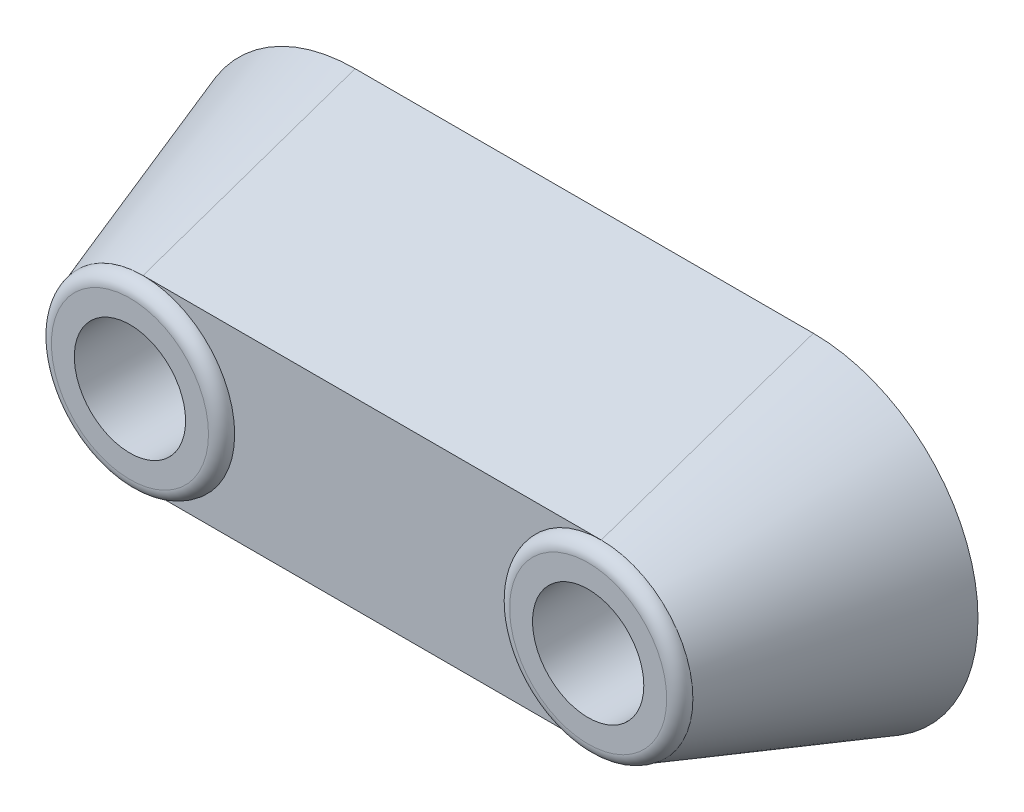
ISO-10303-21;
HEADER;
FILE_DESCRIPTION(('STEP AP214'),'2;1');
FILE_NAME('part.step','',(''),(''),'','','');
FILE_SCHEMA(('AUTOMOTIVE_DESIGN { 1 0 10303 214 1 1 1 1 }'));
ENDSEC;
DATA;
#1=APPLICATION_CONTEXT('core data for automotive mechanical design processes');
#2=APPLICATION_PROTOCOL_DEFINITION('international standard','automotive_design',2000,#1);
#3=PRODUCT_CONTEXT('',#1,'mechanical');
#4=PRODUCT('Part','Part','',(#3));
#5=PRODUCT_RELATED_PRODUCT_CATEGORY('part','',(#4));
#6=PRODUCT_DEFINITION_FORMATION('','',#4);
#7=PRODUCT_DEFINITION_CONTEXT('part definition',#1,'design');
#8=PRODUCT_DEFINITION('design','',#6,#7);
#9=PRODUCT_DEFINITION_SHAPE('','',#8);
#10=(LENGTH_UNIT() NAMED_UNIT(*) SI_UNIT(.MILLI.,.METRE.));
#11=(NAMED_UNIT(*) PLANE_ANGLE_UNIT() SI_UNIT($,.RADIAN.));
#12=(NAMED_UNIT(*) SI_UNIT($,.STERADIAN.) SOLID_ANGLE_UNIT());
#13=UNCERTAINTY_MEASURE_WITH_UNIT(LENGTH_MEASURE(1.E-05),#10,'distance_accuracy_value','');
#14=(GEOMETRIC_REPRESENTATION_CONTEXT(3) GLOBAL_UNCERTAINTY_ASSIGNED_CONTEXT((#13)) GLOBAL_UNIT_ASSIGNED_CONTEXT((#10,
#11,#12)) REPRESENTATION_CONTEXT('',''));
#15=CARTESIAN_POINT('',(0.,0.,0.));
#16=DIRECTION('',(0.,0.,1.));
#17=DIRECTION('',(1.,0.,0.));
#18=AXIS2_PLACEMENT_3D('',#15,#16,#17);
#19=CARTESIAN_POINT('',(-20.,-14.5,3.));
#20=DIRECTION('',(0.,0.,1.));
#21=DIRECTION('',(1.,0.,0.));
#22=AXIS2_PLACEMENT_3D('',#19,#20,#21);
#23=PLANE('',#22);
#24=CARTESIAN_POINT('',(9.,-26.5,3.));
#25=DIRECTION('',(0.,0.,1.));
#26=DIRECTION('',(1.,0.,0.));
#27=AXIS2_PLACEMENT_3D('',#24,#25,#26);
#28=CIRCLE('',#27,7.);
#29=CARTESIAN_POINT('',(9.,-19.5,3.));
#30=VERTEX_POINT('',#29);
#31=CARTESIAN_POINT('',(9.,-33.5,3.));
#32=VERTEX_POINT('',#31);
#33=EDGE_CURVE('E48',#30,#32,#28,.T.);
#34=ORIENTED_EDGE('',*,*,#33,.F.);
#35=DIRECTION('',(-1.,0.,0.));
#36=VECTOR('',#35,1.);
#37=CARTESIAN_POINT('',(-26.,-19.5,3.));
#38=LINE('',#37,#36);
#39=CARTESIAN_POINT('',(-26.,-19.5,3.));
#40=VERTEX_POINT('',#39);
#41=EDGE_CURVE('E69',#30,#40,#38,.T.);
#42=ORIENTED_EDGE('',*,*,#41,.T.);
#43=CARTESIAN_POINT('',(-26.,-26.5,3.));
#44=DIRECTION('',(0.,0.,1.));
#45=DIRECTION('',(1.,0.,0.));
#46=AXIS2_PLACEMENT_3D('',#43,#44,#45);
#47=CIRCLE('',#46,7.);
#48=CARTESIAN_POINT('',(-26.,-33.5,3.));
#49=VERTEX_POINT('',#48);
#50=EDGE_CURVE('E71',#49,#40,#47,.T.);
#51=ORIENTED_EDGE('',*,*,#50,.F.);
#52=DIRECTION('',(1.,0.,0.));
#53=VECTOR('',#52,1.);
#54=CARTESIAN_POINT('',(9.,-33.5,3.));
#55=LINE('',#54,#53);
#56=EDGE_CURVE('E75',#49,#32,#55,.T.);
#57=ORIENTED_EDGE('',*,*,#56,.T.);
#58=EDGE_LOOP('',(#34,#42,#51,#57));
#59=FACE_BOUND('',#58,.T.);
#60=ADVANCED_FACE('F33',(#59),#23,.T.);
#61=CARTESIAN_POINT('',(9.,-26.5,3.));
#62=DIRECTION('',(0.,0.,-1.));
#63=DIRECTION('',(-1.,0.,0.));
#64=AXIS2_PLACEMENT_3D('',#61,#62,#63);
#65=CYLINDRICAL_SURFACE('',#64,4.25);
#66=CARTESIAN_POINT('',(9.,-26.5,4.));
#67=DIRECTION('',(0.,0.,1.));
#68=DIRECTION('',(1.,0.,0.));
#69=AXIS2_PLACEMENT_3D('',#66,#67,#68);
#70=CIRCLE('',#69,4.25);
#71=CARTESIAN_POINT('',(13.25,-26.5,4.));
#72=VERTEX_POINT('',#71);
#73=EDGE_CURVE('E91',#72,#72,#70,.T.);
#74=ORIENTED_EDGE('',*,*,#73,.T.);
#75=EDGE_LOOP('',(#74));
#76=FACE_BOUND('',#75,.T.);
#77=CARTESIAN_POINT('',(9.,-26.5,-13.2));
#78=DIRECTION('',(0.,0.,1.));
#79=DIRECTION('',(1.,0.,0.));
#80=AXIS2_PLACEMENT_3D('',#77,#78,#79);
#81=CIRCLE('',#80,4.25);
#82=CARTESIAN_POINT('',(13.25,-26.5,-13.2));
#83=VERTEX_POINT('',#82);
#84=EDGE_CURVE('E250',#83,#83,#81,.T.);
#85=ORIENTED_EDGE('',*,*,#84,.F.);
#86=EDGE_LOOP('',(#85));
#87=FACE_BOUND('',#86,.T.);
#88=ADVANCED_FACE('F125',(#76,#87),#65,.F.);
#89=CARTESIAN_POINT('',(-26.,-26.5,3.));
#90=DIRECTION('',(0.,0.,-1.));
#91=DIRECTION('',(-1.,0.,0.));
#92=AXIS2_PLACEMENT_3D('',#89,#90,#91);
#93=CYLINDRICAL_SURFACE('',#92,4.25);
#94=CARTESIAN_POINT('',(-26.,-26.5,4.));
#95=DIRECTION('',(0.,0.,1.));
#96=DIRECTION('',(1.,0.,0.));
#97=AXIS2_PLACEMENT_3D('',#94,#95,#96);
#98=CIRCLE('',#97,4.25);
#99=CARTESIAN_POINT('',(-21.75,-26.5,4.));
#100=VERTEX_POINT('',#99);
#101=EDGE_CURVE('E76',#100,#100,#98,.T.);
#102=ORIENTED_EDGE('',*,*,#101,.T.);
#103=EDGE_LOOP('',(#102));
#104=FACE_BOUND('',#103,.T.);
#105=CARTESIAN_POINT('',(-26.,-26.5,-13.2));
#106=DIRECTION('',(0.,0.,1.));
#107=DIRECTION('',(1.,0.,0.));
#108=AXIS2_PLACEMENT_3D('',#105,#106,#107);
#109=CIRCLE('',#108,4.25);
#110=CARTESIAN_POINT('',(-21.75,-26.5,-13.2));
#111=VERTEX_POINT('',#110);
#112=EDGE_CURVE('E249',#111,#111,#109,.T.);
#113=ORIENTED_EDGE('',*,*,#112,.F.);
#114=EDGE_LOOP('',(#113));
#115=FACE_BOUND('',#114,.T.);
#116=ADVANCED_FACE('F130',(#104,#115),#93,.F.);
#117=CARTESIAN_POINT('',(-26.,-26.5,4.));
#118=DIRECTION('',(0.,0.,1.));
#119=DIRECTION('',(1.,0.,0.));
#120=AXIS2_PLACEMENT_3D('',#117,#118,#119);
#121=PLANE('',#120);
#122=CARTESIAN_POINT('',(-26.,-26.5,4.));
#123=DIRECTION('',(0.,0.,1.));
#124=DIRECTION('',(1.,0.,0.));
#125=AXIS2_PLACEMENT_3D('',#122,#123,#124);
#126=CIRCLE('',#125,6.);
#127=CARTESIAN_POINT('',(-20.,-26.5,4.));
#128=VERTEX_POINT('',#127);
#129=EDGE_CURVE('E41',#128,#128,#126,.T.);
#130=ORIENTED_EDGE('',*,*,#129,.T.);
#131=EDGE_LOOP('',(#130));
#132=FACE_BOUND('',#131,.T.);
#133=ORIENTED_EDGE('',*,*,#101,.F.);
#134=EDGE_LOOP('',(#133));
#135=FACE_BOUND('',#134,.T.);
#136=ADVANCED_FACE('F112',(#132,#135),#121,.T.);
#137=CARTESIAN_POINT('',(9.,-26.5,4.));
#138=DIRECTION('',(0.,0.,1.));
#139=DIRECTION('',(1.,0.,0.));
#140=AXIS2_PLACEMENT_3D('',#137,#138,#139);
#141=PLANE('',#140);
#142=CARTESIAN_POINT('',(9.,-26.5,4.));
#143=DIRECTION('',(0.,0.,1.));
#144=DIRECTION('',(1.,0.,0.));
#145=AXIS2_PLACEMENT_3D('',#142,#143,#144);
#146=CIRCLE('',#145,6.);
#147=CARTESIAN_POINT('',(15.,-26.5,4.));
#148=VERTEX_POINT('',#147);
#149=EDGE_CURVE('E81',#148,#148,#146,.T.);
#150=ORIENTED_EDGE('',*,*,#149,.T.);
#151=EDGE_LOOP('',(#150));
#152=FACE_BOUND('',#151,.T.);
#153=ORIENTED_EDGE('',*,*,#73,.F.);
#154=EDGE_LOOP('',(#153));
#155=FACE_BOUND('',#154,.T.);
#156=ADVANCED_FACE('F123',(#152,#155),#141,.T.);
#157=CARTESIAN_POINT('',(9.,-26.5,3.));
#158=DIRECTION('',(0.,0.,1.));
#159=DIRECTION('',(1.,0.,0.));
#160=AXIS2_PLACEMENT_3D('',#157,#158,#159);
#161=TOROIDAL_SURFACE('',#160,6.,1.);
#162=ORIENTED_EDGE('',*,*,#33,.T.);
#163=EDGE_CURVE('E232',#32,#30,#28,.T.);
#164=ORIENTED_EDGE('',*,*,#163,.T.);
#165=EDGE_LOOP('',(#162,#164));
#166=FACE_BOUND('',#165,.T.);
#167=ORIENTED_EDGE('',*,*,#149,.F.);
#168=EDGE_LOOP('',(#167));
#169=FACE_BOUND('',#168,.T.);
#170=ADVANCED_FACE('F116',(#166,#169),#161,.T.);
#171=CARTESIAN_POINT('',(-26.,-26.5,3.));
#172=DIRECTION('',(0.,0.,1.));
#173=DIRECTION('',(1.,0.,0.));
#174=AXIS2_PLACEMENT_3D('',#171,#172,#173);
#175=TOROIDAL_SURFACE('',#174,6.,1.);
#176=ORIENTED_EDGE('',*,*,#50,.T.);
#177=CARTESIAN_POINT('',(-26.,-26.5,3.));
#178=DIRECTION('',(0.,0.,1.));
#179=DIRECTION('',(1.,0.,0.));
#180=AXIS2_PLACEMENT_3D('',#177,#178,#179);
#181=CIRCLE('',#180,7.);
#182=EDGE_CURVE('E11',#49,#40,#181,.F.);
#183=ORIENTED_EDGE('',*,*,#182,.F.);
#184=EDGE_LOOP('',(#176,#183));
#185=FACE_BOUND('',#184,.T.);
#186=ORIENTED_EDGE('',*,*,#129,.F.);
#187=EDGE_LOOP('',(#186));
#188=FACE_BOUND('',#187,.T.);
#189=ADVANCED_FACE('F35',(#185,#188),#175,.T.);
#190=CARTESIAN_POINT('',(-26.,-26.5,-13.2));
#191=DIRECTION('',(0.,0.,1.));
#192=DIRECTION('',(1.,0.,0.));
#193=AXIS2_PLACEMENT_3D('',#190,#191,#192);
#194=PLANE('',#193);
#195=ORIENTED_EDGE('',*,*,#112,.T.);
#196=EDGE_LOOP('',(#195));
#197=FACE_BOUND('',#196,.T.);
#198=ORIENTED_EDGE('',*,*,#84,.T.);
#199=EDGE_LOOP('',(#198));
#200=FACE_BOUND('',#199,.T.);
#201=CARTESIAN_POINT('',(-26.,-26.5,-13.2));
#202=DIRECTION('',(0.,0.,1.));
#203=DIRECTION('',(1.,0.,0.));
#204=AXIS2_PLACEMENT_3D('',#201,#202,#203);
#205=CIRCLE('',#204,12.5781073352926);
#206=CARTESIAN_POINT('',(-26.,-13.9218926647074,-13.2));
#207=VERTEX_POINT('',#206);
#208=CARTESIAN_POINT('',(-26.,-39.0781073352926,-13.2));
#209=VERTEX_POINT('',#208);
#210=EDGE_CURVE('E97',#207,#209,#205,.T.);
#211=ORIENTED_EDGE('',*,*,#210,.F.);
#212=DIRECTION('',(-1.,0.,0.));
#213=VECTOR('',#212,1.);
#214=CARTESIAN_POINT('',(-26.,-13.9218926647074,-13.2));
#215=LINE('',#214,#213);
#216=CARTESIAN_POINT('',(9.,-13.9218926647074,-13.2));
#217=VERTEX_POINT('',#216);
#218=EDGE_CURVE('E87',#217,#207,#215,.T.);
#219=ORIENTED_EDGE('',*,*,#218,.F.);
#220=CARTESIAN_POINT('',(9.,-26.5,-13.2));
#221=DIRECTION('',(0.,0.,1.));
#222=DIRECTION('',(1.,0.,0.));
#223=AXIS2_PLACEMENT_3D('',#220,#221,#222);
#224=CIRCLE('',#223,12.5781073352926);
#225=CARTESIAN_POINT('',(9.00000000000001,-39.0781073352926,-13.2));
#226=VERTEX_POINT('',#225);
#227=EDGE_CURVE('E245',#226,#217,#224,.T.);
#228=ORIENTED_EDGE('',*,*,#227,.F.);
#229=DIRECTION('',(1.,0.,0.));
#230=VECTOR('',#229,1.);
#231=CARTESIAN_POINT('',(-26.,-39.0781073352926,-13.2));
#232=LINE('',#231,#230);
#233=EDGE_CURVE('E243',#209,#226,#232,.T.);
#234=ORIENTED_EDGE('',*,*,#233,.F.);
#235=EDGE_LOOP('',(#211,#219,#228,#234));
#236=FACE_BOUND('',#235,.T.);
#237=ADVANCED_FACE('F115',(#197,#200,#236),#194,.F.);
#238=CARTESIAN_POINT('',(-26.,-33.5,3.));
#239=DIRECTION('',(0.,-0.945518575599317,0.325568154457157));
#240=DIRECTION('',(0.,-0.325568154457157,-0.945518575599317));
#241=AXIS2_PLACEMENT_3D('',#238,#239,#240);
#242=PLANE('',#241);
#243=ORIENTED_EDGE('',*,*,#56,.F.);
#244=DIRECTION('',(0.,-0.325568154457157,-0.945518575599317));
#245=VECTOR('',#244,1.);
#246=CARTESIAN_POINT('',(-26.,-33.5,3.));
#247=LINE('',#246,#245);
#248=EDGE_CURVE('E95',#209,#49,#247,.F.);
#249=ORIENTED_EDGE('',*,*,#248,.F.);
#250=ORIENTED_EDGE('',*,*,#233,.T.);
#251=DIRECTION('',(0.,-0.325568154457157,-0.945518575599317));
#252=VECTOR('',#251,1.);
#253=CARTESIAN_POINT('',(9.00000000000001,-33.5,3.));
#254=LINE('',#253,#252);
#255=EDGE_CURVE('E101',#226,#32,#254,.F.);
#256=ORIENTED_EDGE('',*,*,#255,.T.);
#257=EDGE_LOOP('',(#243,#249,#250,#256));
#258=FACE_BOUND('',#257,.T.);
#259=ADVANCED_FACE('F104',(#258),#242,.T.);
#260=CARTESIAN_POINT('',(9.,-26.5,3.));
#261=DIRECTION('',(0.,0.,-1.));
#262=DIRECTION('',(1.,0.,0.));
#263=AXIS2_PLACEMENT_3D('',#260,#261,#262);
#264=CONICAL_SURFACE('',#263,7.00000000000001,0.331612557878923);
#265=ORIENTED_EDGE('',*,*,#163,.F.);
#266=ORIENTED_EDGE('',*,*,#255,.F.);
#267=ORIENTED_EDGE('',*,*,#227,.T.);
#268=DIRECTION('',(0.,0.325568154457157,-0.945518575599317));
#269=VECTOR('',#268,1.);
#270=CARTESIAN_POINT('',(9.,-19.5,3.));
#271=LINE('',#270,#269);
#272=EDGE_CURVE('E92',#217,#30,#271,.F.);
#273=ORIENTED_EDGE('',*,*,#272,.T.);
#274=EDGE_LOOP('',(#265,#266,#267,#273));
#275=FACE_BOUND('',#274,.T.);
#276=ADVANCED_FACE('F144',(#275),#264,.T.);
#277=CARTESIAN_POINT('',(-26.,-19.5,3.));
#278=DIRECTION('',(0.,0.945518575599317,0.325568154457157));
#279=DIRECTION('',(0.,-0.325568154457157,0.945518575599317));
#280=AXIS2_PLACEMENT_3D('',#277,#278,#279);
#281=PLANE('',#280);
#282=ORIENTED_EDGE('',*,*,#41,.F.);
#283=ORIENTED_EDGE('',*,*,#272,.F.);
#284=ORIENTED_EDGE('',*,*,#218,.T.);
#285=DIRECTION('',(0.,0.325568154457157,-0.945518575599317));
#286=VECTOR('',#285,1.);
#287=CARTESIAN_POINT('',(-26.,-19.5,3.));
#288=LINE('',#287,#286);
#289=EDGE_CURVE('E84',#207,#40,#288,.F.);
#290=ORIENTED_EDGE('',*,*,#289,.T.);
#291=EDGE_LOOP('',(#282,#283,#284,#290));
#292=FACE_BOUND('',#291,.T.);
#293=ADVANCED_FACE('F85',(#292),#281,.T.);
#294=CARTESIAN_POINT('',(-26.,-26.5,3.));
#295=DIRECTION('',(0.,0.,-1.));
#296=DIRECTION('',(1.,0.,0.));
#297=AXIS2_PLACEMENT_3D('',#294,#295,#296);
#298=CONICAL_SURFACE('',#297,7.00000000000001,0.331612557878923);
#299=ORIENTED_EDGE('',*,*,#182,.T.);
#300=ORIENTED_EDGE('',*,*,#289,.F.);
#301=ORIENTED_EDGE('',*,*,#210,.T.);
#302=ORIENTED_EDGE('',*,*,#248,.T.);
#303=EDGE_LOOP('',(#299,#300,#301,#302));
#304=FACE_BOUND('',#303,.T.);
#305=ADVANCED_FACE('F94',(#304),#298,.T.);
#306=CLOSED_SHELL('',(#60,#88,#116,#136,#156,#170,#189,#237,#259,#276,#293,#305));
#307=MANIFOLD_SOLID_BREP('B2',#306);
#308=ADVANCED_BREP_SHAPE_REPRESENTATION('',(#18,#307),#14);
#309=SHAPE_DEFINITION_REPRESENTATION(#9,#308);
ENDSEC;
END-ISO-10303-21;
